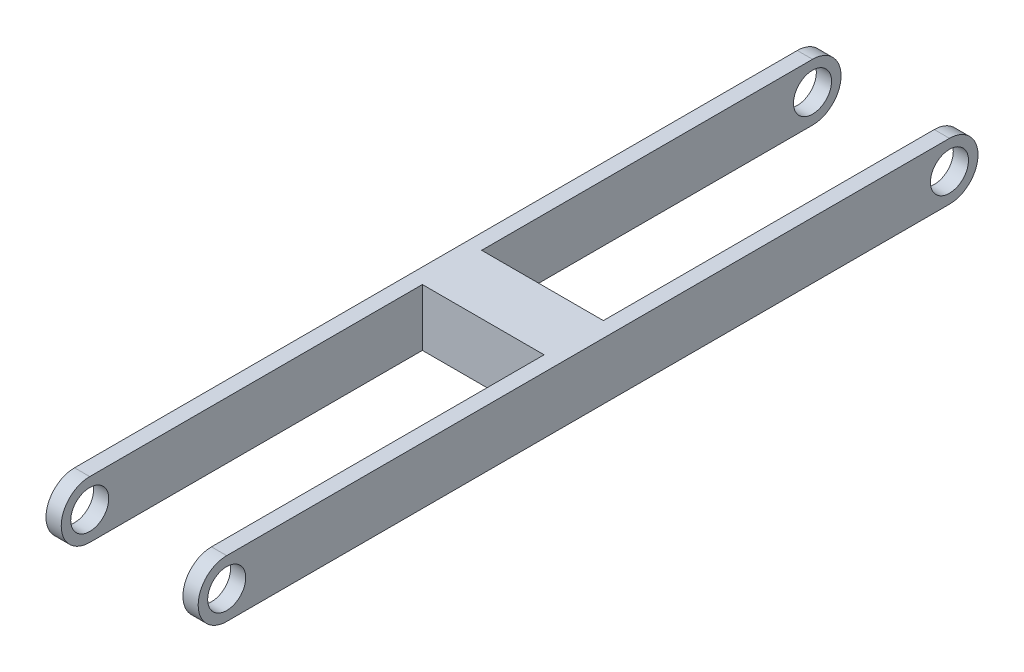
ISO-10303-21;
HEADER;
FILE_DESCRIPTION(('STEP AP214'),'2;1');
FILE_NAME('part.step','',(''),(''),'','','');
FILE_SCHEMA(('AUTOMOTIVE_DESIGN { 1 0 10303 214 1 1 1 1 }'));
ENDSEC;
DATA;
#1=APPLICATION_CONTEXT('core data for automotive mechanical design processes');
#2=APPLICATION_PROTOCOL_DEFINITION('international standard','automotive_design',2000,#1);
#3=PRODUCT_CONTEXT('',#1,'mechanical');
#4=PRODUCT('Part','Part','',(#3));
#5=PRODUCT_RELATED_PRODUCT_CATEGORY('part','',(#4));
#6=PRODUCT_DEFINITION_FORMATION('','',#4);
#7=PRODUCT_DEFINITION_CONTEXT('part definition',#1,'design');
#8=PRODUCT_DEFINITION('design','',#6,#7);
#9=PRODUCT_DEFINITION_SHAPE('','',#8);
#10=(LENGTH_UNIT() NAMED_UNIT(*) SI_UNIT(.MILLI.,.METRE.));
#11=(NAMED_UNIT(*) PLANE_ANGLE_UNIT() SI_UNIT($,.RADIAN.));
#12=(NAMED_UNIT(*) SI_UNIT($,.STERADIAN.) SOLID_ANGLE_UNIT());
#13=UNCERTAINTY_MEASURE_WITH_UNIT(LENGTH_MEASURE(1.E-05),#10,'distance_accuracy_value','');
#14=(GEOMETRIC_REPRESENTATION_CONTEXT(3) GLOBAL_UNCERTAINTY_ASSIGNED_CONTEXT((#13)) GLOBAL_UNIT_ASSIGNED_CONTEXT((#10,
#11,#12)) REPRESENTATION_CONTEXT('',''));
#15=CARTESIAN_POINT('',(0.,0.,0.));
#16=DIRECTION('',(0.,0.,1.));
#17=DIRECTION('',(1.,0.,0.));
#18=AXIS2_PLACEMENT_3D('',#15,#16,#17);
#19=CARTESIAN_POINT('',(20.,0.,47.4999999999999));
#20=DIRECTION('',(-1.,0.,0.));
#21=DIRECTION('',(0.,0.,1.));
#22=AXIS2_PLACEMENT_3D('',#19,#20,#21);
#23=CYLINDRICAL_SURFACE('',#22,3.74999999999997);
#24=CARTESIAN_POINT('',(18.,0.,47.4999999999999));
#25=DIRECTION('',(1.,0.,0.));
#26=DIRECTION('',(0.,0.,-1.));
#27=AXIS2_PLACEMENT_3D('',#24,#25,#26);
#28=CIRCLE('',#27,3.74999999999997);
#29=CARTESIAN_POINT('',(18.,3.74999999999997,47.4999999999999));
#30=VERTEX_POINT('',#29);
#31=CARTESIAN_POINT('',(18.,-3.75000000000003,47.4999999999999));
#32=VERTEX_POINT('',#31);
#33=EDGE_CURVE('E177',#30,#32,#28,.T.);
#34=ORIENTED_EDGE('',*,*,#33,.T.);
#35=DIRECTION('',(-1.,0.,0.));
#36=VECTOR('',#35,1.);
#37=CARTESIAN_POINT('',(20.,-3.74999999999997,47.4999999999999));
#38=LINE('',#37,#36);
#39=CARTESIAN_POINT('',(20.,-3.74999999999997,47.4999999999999));
#40=VERTEX_POINT('',#39);
#41=EDGE_CURVE('E139',#40,#32,#38,.T.);
#42=ORIENTED_EDGE('',*,*,#41,.F.);
#43=CARTESIAN_POINT('',(20.,0.,47.4999999999999));
#44=DIRECTION('',(1.,0.,0.));
#45=DIRECTION('',(0.,0.,1.));
#46=AXIS2_PLACEMENT_3D('',#43,#44,#45);
#47=CIRCLE('',#46,3.74999999999997);
#48=CARTESIAN_POINT('',(20.,3.74999999999997,47.4999999999999));
#49=VERTEX_POINT('',#48);
#50=EDGE_CURVE('E192',#49,#40,#47,.T.);
#51=ORIENTED_EDGE('',*,*,#50,.F.);
#52=DIRECTION('',(-1.,0.,0.));
#53=VECTOR('',#52,1.);
#54=CARTESIAN_POINT('',(20.,3.74999999999997,47.4999999999999));
#55=LINE('',#54,#53);
#56=EDGE_CURVE('E213',#49,#30,#55,.T.);
#57=ORIENTED_EDGE('',*,*,#56,.T.);
#58=EDGE_LOOP('',(#34,#42,#51,#57));
#59=FACE_BOUND('',#58,.T.);
#60=ADVANCED_FACE('F32',(#59),#23,.T.);
#61=CARTESIAN_POINT('',(20.,0.,-47.5000000000001));
#62=DIRECTION('',(-1.,0.,0.));
#63=DIRECTION('',(0.,0.,1.));
#64=AXIS2_PLACEMENT_3D('',#61,#62,#63);
#65=CYLINDRICAL_SURFACE('',#64,3.75);
#66=CARTESIAN_POINT('',(1.99999999999999,0.,-47.5000000000001));
#67=DIRECTION('',(-1.,0.,0.));
#68=DIRECTION('',(0.,0.,1.));
#69=AXIS2_PLACEMENT_3D('',#66,#67,#68);
#70=CIRCLE('',#69,3.75);
#71=CARTESIAN_POINT('',(1.99999999999999,3.75000000000002,-47.5000000000001));
#72=VERTEX_POINT('',#71);
#73=CARTESIAN_POINT('',(1.99999999999999,-3.74999999999998,-47.5000000000001));
#74=VERTEX_POINT('',#73);
#75=EDGE_CURVE('E167',#72,#74,#70,.T.);
#76=ORIENTED_EDGE('',*,*,#75,.T.);
#77=DIRECTION('',(-1.,0.,0.));
#78=VECTOR('',#77,1.);
#79=CARTESIAN_POINT('',(20.,-3.74999999999998,-47.5000000000001));
#80=LINE('',#79,#78);
#81=CARTESIAN_POINT('',(0.,-3.74999999999998,-47.5000000000001));
#82=VERTEX_POINT('',#81);
#83=EDGE_CURVE('E220',#74,#82,#80,.T.);
#84=ORIENTED_EDGE('',*,*,#83,.T.);
#85=CARTESIAN_POINT('',(0.,0.,-47.5000000000001));
#86=DIRECTION('',(1.,0.,0.));
#87=DIRECTION('',(0.,0.,1.));
#88=AXIS2_PLACEMENT_3D('',#85,#86,#87);
#89=CIRCLE('',#88,3.75);
#90=CARTESIAN_POINT('',(0.,3.75000000000002,-47.5000000000001));
#91=VERTEX_POINT('',#90);
#92=EDGE_CURVE('E208',#82,#91,#89,.T.);
#93=ORIENTED_EDGE('',*,*,#92,.T.);
#94=DIRECTION('',(-1.,0.,0.));
#95=VECTOR('',#94,1.);
#96=CARTESIAN_POINT('',(20.,3.75000000000002,-47.5000000000001));
#97=LINE('',#96,#95);
#98=EDGE_CURVE('E216',#72,#91,#97,.T.);
#99=ORIENTED_EDGE('',*,*,#98,.F.);
#100=EDGE_LOOP('',(#76,#84,#93,#99));
#101=FACE_BOUND('',#100,.T.);
#102=ADVANCED_FACE('F248',(#101),#65,.T.);
#103=CARTESIAN_POINT('',(20.,0.,47.4999999999999));
#104=DIRECTION('',(-1.,0.,0.));
#105=DIRECTION('',(0.,0.,1.));
#106=AXIS2_PLACEMENT_3D('',#103,#104,#105);
#107=CYLINDRICAL_SURFACE('',#106,2.5);
#108=CARTESIAN_POINT('',(18.,0.,47.4999999999999));
#109=DIRECTION('',(1.,0.,0.));
#110=DIRECTION('',(0.,0.,-1.));
#111=AXIS2_PLACEMENT_3D('',#108,#109,#110);
#112=CIRCLE('',#111,2.5);
#113=CARTESIAN_POINT('',(18.,0.,44.9999999999999));
#114=VERTEX_POINT('',#113);
#115=EDGE_CURVE('E175',#114,#114,#112,.T.);
#116=ORIENTED_EDGE('',*,*,#115,.F.);
#117=EDGE_LOOP('',(#116));
#118=FACE_BOUND('',#117,.T.);
#119=CARTESIAN_POINT('',(20.,0.,47.4999999999999));
#120=DIRECTION('',(1.,0.,0.));
#121=DIRECTION('',(0.,0.,-1.));
#122=AXIS2_PLACEMENT_3D('',#119,#120,#121);
#123=CIRCLE('',#122,2.5);
#124=CARTESIAN_POINT('',(20.,0.,44.9999999999999));
#125=VERTEX_POINT('',#124);
#126=EDGE_CURVE('E186',#125,#125,#123,.T.);
#127=ORIENTED_EDGE('',*,*,#126,.T.);
#128=EDGE_LOOP('',(#127));
#129=FACE_BOUND('',#128,.T.);
#130=ADVANCED_FACE('F282',(#118,#129),#107,.F.);
#131=CARTESIAN_POINT('',(20.,0.,-47.5000000000001));
#132=DIRECTION('',(-1.,0.,0.));
#133=DIRECTION('',(0.,0.,1.));
#134=AXIS2_PLACEMENT_3D('',#131,#132,#133);
#135=CYLINDRICAL_SURFACE('',#134,2.5);
#136=CARTESIAN_POINT('',(1.99999999999999,0.,-47.5000000000001));
#137=DIRECTION('',(-1.,0.,0.));
#138=DIRECTION('',(0.,0.,1.));
#139=AXIS2_PLACEMENT_3D('',#136,#137,#138);
#140=CIRCLE('',#139,2.5);
#141=CARTESIAN_POINT('',(1.99999999999999,0.,-45.0000000000001));
#142=VERTEX_POINT('',#141);
#143=EDGE_CURVE('E163',#142,#142,#140,.T.);
#144=ORIENTED_EDGE('',*,*,#143,.F.);
#145=EDGE_LOOP('',(#144));
#146=FACE_BOUND('',#145,.T.);
#147=CARTESIAN_POINT('',(0.,0.,-47.5000000000001));
#148=DIRECTION('',(1.,0.,0.));
#149=DIRECTION('',(0.,0.,-1.));
#150=AXIS2_PLACEMENT_3D('',#147,#148,#149);
#151=CIRCLE('',#150,2.5);
#152=CARTESIAN_POINT('',(0.,0.,-50.0000000000001));
#153=VERTEX_POINT('',#152);
#154=EDGE_CURVE('E179',#153,#153,#151,.T.);
#155=ORIENTED_EDGE('',*,*,#154,.F.);
#156=EDGE_LOOP('',(#155));
#157=FACE_BOUND('',#156,.T.);
#158=ADVANCED_FACE('F295',(#146,#157),#135,.F.);
#159=CARTESIAN_POINT('',(20.,0.,47.4999999999999));
#160=DIRECTION('',(-1.,0.,0.));
#161=DIRECTION('',(0.,0.,1.));
#162=AXIS2_PLACEMENT_3D('',#159,#160,#161);
#163=PLANE('',#162);
#164=ORIENTED_EDGE('',*,*,#50,.T.);
#165=DIRECTION('',(0.,0.,-1.));
#166=VECTOR('',#165,1.);
#167=CARTESIAN_POINT('',(20.,-3.74999999999998,-47.5000000000001));
#168=LINE('',#167,#166);
#169=CARTESIAN_POINT('',(20.,-3.74999999999998,-47.5000000000001));
#170=VERTEX_POINT('',#169);
#171=EDGE_CURVE('E195',#40,#170,#168,.T.);
#172=ORIENTED_EDGE('',*,*,#171,.T.);
#173=CARTESIAN_POINT('',(20.,0.,-47.5000000000001));
#174=DIRECTION('',(1.,0.,0.));
#175=DIRECTION('',(0.,0.,1.));
#176=AXIS2_PLACEMENT_3D('',#173,#174,#175);
#177=CIRCLE('',#176,3.75);
#178=CARTESIAN_POINT('',(20.,3.75000000000002,-47.5000000000001));
#179=VERTEX_POINT('',#178);
#180=EDGE_CURVE('E198',#170,#179,#177,.T.);
#181=ORIENTED_EDGE('',*,*,#180,.T.);
#182=DIRECTION('',(0.,0.,1.));
#183=VECTOR('',#182,1.);
#184=CARTESIAN_POINT('',(20.,3.75000000000002,-47.5000000000001));
#185=LINE('',#184,#183);
#186=EDGE_CURVE('E200',#179,#49,#185,.T.);
#187=ORIENTED_EDGE('',*,*,#186,.T.);
#188=EDGE_LOOP('',(#164,#172,#181,#187));
#189=FACE_BOUND('',#188,.T.);
#190=ORIENTED_EDGE('',*,*,#126,.F.);
#191=EDGE_LOOP('',(#190));
#192=FACE_BOUND('',#191,.T.);
#193=CARTESIAN_POINT('',(20.,0.,-47.5000000000001));
#194=DIRECTION('',(1.,0.,0.));
#195=DIRECTION('',(0.,0.,-1.));
#196=AXIS2_PLACEMENT_3D('',#193,#194,#195);
#197=CIRCLE('',#196,2.5);
#198=CARTESIAN_POINT('',(20.,0.,-50.0000000000001));
#199=VERTEX_POINT('',#198);
#200=EDGE_CURVE('E180',#199,#199,#197,.T.);
#201=ORIENTED_EDGE('',*,*,#200,.F.);
#202=EDGE_LOOP('',(#201));
#203=FACE_BOUND('',#202,.T.);
#204=ADVANCED_FACE('F267',(#189,#192,#203),#163,.F.);
#205=CARTESIAN_POINT('',(0.,0.,47.4999999999999));
#206=DIRECTION('',(-1.,0.,0.));
#207=DIRECTION('',(0.,0.,1.));
#208=AXIS2_PLACEMENT_3D('',#205,#206,#207);
#209=PLANE('',#208);
#210=CARTESIAN_POINT('',(0.,0.,47.4999999999999));
#211=DIRECTION('',(1.,0.,0.));
#212=DIRECTION('',(0.,0.,-1.));
#213=AXIS2_PLACEMENT_3D('',#210,#211,#212);
#214=CIRCLE('',#213,2.5);
#215=CARTESIAN_POINT('',(0.,0.,44.9999999999999));
#216=VERTEX_POINT('',#215);
#217=EDGE_CURVE('E183',#216,#216,#214,.T.);
#218=ORIENTED_EDGE('',*,*,#217,.T.);
#219=EDGE_LOOP('',(#218));
#220=FACE_BOUND('',#219,.T.);
#221=CARTESIAN_POINT('',(0.,0.,47.4999999999999));
#222=DIRECTION('',(1.,0.,0.));
#223=DIRECTION('',(0.,0.,1.));
#224=AXIS2_PLACEMENT_3D('',#221,#222,#223);
#225=CIRCLE('',#224,3.74999999999997);
#226=CARTESIAN_POINT('',(0.,3.74999999999997,47.4999999999999));
#227=VERTEX_POINT('',#226);
#228=CARTESIAN_POINT('',(0.,-3.74999999999997,47.4999999999999));
#229=VERTEX_POINT('',#228);
#230=EDGE_CURVE('E189',#227,#229,#225,.T.);
#231=ORIENTED_EDGE('',*,*,#230,.F.);
#232=DIRECTION('',(0.,0.,1.));
#233=VECTOR('',#232,1.);
#234=CARTESIAN_POINT('',(0.,3.75000000000002,-47.5000000000001));
#235=LINE('',#234,#233);
#236=EDGE_CURVE('E196',#91,#227,#235,.T.);
#237=ORIENTED_EDGE('',*,*,#236,.F.);
#238=ORIENTED_EDGE('',*,*,#92,.F.);
#239=DIRECTION('',(0.,0.,-1.));
#240=VECTOR('',#239,1.);
#241=CARTESIAN_POINT('',(0.,-3.74999999999998,-47.5000000000001));
#242=LINE('',#241,#240);
#243=EDGE_CURVE('E205',#229,#82,#242,.T.);
#244=ORIENTED_EDGE('',*,*,#243,.F.);
#245=EDGE_LOOP('',(#231,#237,#238,#244));
#246=FACE_BOUND('',#245,.T.);
#247=ORIENTED_EDGE('',*,*,#154,.T.);
#248=EDGE_LOOP('',(#247));
#249=FACE_BOUND('',#248,.T.);
#250=ADVANCED_FACE('F255',(#220,#246,#249),#209,.T.);
#251=CARTESIAN_POINT('',(2.,0.,47.4999999999999));
#252=DIRECTION('',(-1.,0.,0.));
#253=DIRECTION('',(0.,0.,1.));
#254=AXIS2_PLACEMENT_3D('',#251,#252,#253);
#255=CIRCLE('',#254,3.74999999999997);
#256=CARTESIAN_POINT('',(2.,-3.75000000000003,47.4999999999999));
#257=VERTEX_POINT('',#256);
#258=CARTESIAN_POINT('',(2.,3.74999999999997,47.4999999999999));
#259=VERTEX_POINT('',#258);
#260=EDGE_CURVE('E173',#257,#259,#255,.T.);
#261=ORIENTED_EDGE('',*,*,#260,.T.);
#262=EDGE_CURVE('E202',#259,#227,#55,.T.);
#263=ORIENTED_EDGE('',*,*,#262,.T.);
#264=ORIENTED_EDGE('',*,*,#230,.T.);
#265=EDGE_CURVE('E224',#257,#229,#38,.T.);
#266=ORIENTED_EDGE('',*,*,#265,.F.);
#267=EDGE_LOOP('',(#261,#263,#264,#266));
#268=FACE_BOUND('',#267,.T.);
#269=ADVANCED_FACE('F34',(#268),#23,.T.);
#270=CARTESIAN_POINT('',(20.,-3.74999999999998,-47.5000000000001));
#271=DIRECTION('',(0.,1.,0.));
#272=DIRECTION('',(0.,0.,1.));
#273=AXIS2_PLACEMENT_3D('',#270,#271,#272);
#274=PLANE('',#273);
#275=ORIENTED_EDGE('',*,*,#41,.T.);
#276=DIRECTION('',(0.,0.,-1.));
#277=VECTOR('',#276,1.);
#278=CARTESIAN_POINT('',(18.,-3.75000000000001,3.77916470370454));
#279=LINE('',#278,#277);
#280=CARTESIAN_POINT('',(18.,-3.75000000000001,3.77916470370454));
#281=VERTEX_POINT('',#280);
#282=EDGE_CURVE('E122',#32,#281,#279,.T.);
#283=ORIENTED_EDGE('',*,*,#282,.T.);
#284=DIRECTION('',(-1.,0.,0.));
#285=VECTOR('',#284,1.);
#286=CARTESIAN_POINT('',(1.99999999999999,-3.75000000000001,3.77916470370454));
#287=LINE('',#286,#285);
#288=CARTESIAN_POINT('',(1.99999999999999,-3.75000000000001,3.77916470370454));
#289=VERTEX_POINT('',#288);
#290=EDGE_CURVE('E130',#281,#289,#287,.T.);
#291=ORIENTED_EDGE('',*,*,#290,.T.);
#292=DIRECTION('',(0.,0.,1.));
#293=VECTOR('',#292,1.);
#294=CARTESIAN_POINT('',(1.99999999999999,-3.75000000000001,3.77916470370454));
#295=LINE('',#294,#293);
#296=EDGE_CURVE('E127',#289,#257,#295,.T.);
#297=ORIENTED_EDGE('',*,*,#296,.T.);
#298=ORIENTED_EDGE('',*,*,#265,.T.);
#299=ORIENTED_EDGE('',*,*,#243,.T.);
#300=ORIENTED_EDGE('',*,*,#83,.F.);
#301=DIRECTION('',(0.,0.,1.));
#302=VECTOR('',#301,1.);
#303=CARTESIAN_POINT('',(1.99999999999999,-3.74999999999998,-51.2500000000002));
#304=LINE('',#303,#302);
#305=CARTESIAN_POINT('',(1.99999999999999,-3.75,-4.01018627667091));
#306=VERTEX_POINT('',#305);
#307=EDGE_CURVE('E148',#74,#306,#304,.T.);
#308=ORIENTED_EDGE('',*,*,#307,.T.);
#309=DIRECTION('',(1.,0.,0.));
#310=VECTOR('',#309,1.);
#311=CARTESIAN_POINT('',(1.99999999999999,-3.75,-4.01018627667091));
#312=LINE('',#311,#310);
#313=CARTESIAN_POINT('',(18.,-3.75,-4.01018627667091));
#314=VERTEX_POINT('',#313);
#315=EDGE_CURVE('E151',#306,#314,#312,.T.);
#316=ORIENTED_EDGE('',*,*,#315,.T.);
#317=DIRECTION('',(0.,0.,-1.));
#318=VECTOR('',#317,1.);
#319=CARTESIAN_POINT('',(18.,-3.74999999999998,-51.2500000000002));
#320=LINE('',#319,#318);
#321=CARTESIAN_POINT('',(18.,-3.74999999999998,-47.5000000000001));
#322=VERTEX_POINT('',#321);
#323=EDGE_CURVE('E154',#314,#322,#320,.T.);
#324=ORIENTED_EDGE('',*,*,#323,.T.);
#325=EDGE_CURVE('E221',#170,#322,#80,.T.);
#326=ORIENTED_EDGE('',*,*,#325,.F.);
#327=ORIENTED_EDGE('',*,*,#171,.F.);
#328=EDGE_LOOP('',(#275,#283,#291,#297,#298,#299,#300,#308,#316,#324,#326,#327));
#329=FACE_BOUND('',#328,.T.);
#330=ADVANCED_FACE('F137',(#329),#274,.F.);
#331=CARTESIAN_POINT('',(18.,0.,-47.5000000000001));
#332=DIRECTION('',(1.,0.,0.));
#333=DIRECTION('',(0.,0.,-1.));
#334=AXIS2_PLACEMENT_3D('',#331,#332,#333);
#335=CIRCLE('',#334,3.75);
#336=CARTESIAN_POINT('',(18.,3.75000000000002,-47.5000000000001));
#337=VERTEX_POINT('',#336);
#338=EDGE_CURVE('E161',#322,#337,#335,.T.);
#339=ORIENTED_EDGE('',*,*,#338,.T.);
#340=EDGE_CURVE('E217',#179,#337,#97,.T.);
#341=ORIENTED_EDGE('',*,*,#340,.F.);
#342=ORIENTED_EDGE('',*,*,#180,.F.);
#343=ORIENTED_EDGE('',*,*,#325,.T.);
#344=EDGE_LOOP('',(#339,#341,#342,#343));
#345=FACE_BOUND('',#344,.T.);
#346=ADVANCED_FACE('F272',(#345),#65,.T.);
#347=CARTESIAN_POINT('',(20.,3.75000000000002,-47.5000000000001));
#348=DIRECTION('',(0.,-1.,0.));
#349=DIRECTION('',(0.,0.,-1.));
#350=AXIS2_PLACEMENT_3D('',#347,#348,#349);
#351=PLANE('',#350);
#352=DIRECTION('',(1.,0.,0.));
#353=VECTOR('',#352,1.);
#354=CARTESIAN_POINT('',(20.,3.74999999999999,3.77916470370455));
#355=LINE('',#354,#353);
#356=CARTESIAN_POINT('',(1.99999999999999,3.74999999999999,3.77916470370455));
#357=VERTEX_POINT('',#356);
#358=CARTESIAN_POINT('',(18.,3.74999999999999,3.77916470370455));
#359=VERTEX_POINT('',#358);
#360=EDGE_CURVE('E11',#357,#359,#355,.T.);
#361=ORIENTED_EDGE('',*,*,#360,.T.);
#362=DIRECTION('',(0.,0.,1.));
#363=VECTOR('',#362,1.);
#364=CARTESIAN_POINT('',(18.,3.75000000000002,-47.5000000000001));
#365=LINE('',#364,#363);
#366=EDGE_CURVE('E125',#359,#30,#365,.T.);
#367=ORIENTED_EDGE('',*,*,#366,.T.);
#368=ORIENTED_EDGE('',*,*,#56,.F.);
#369=ORIENTED_EDGE('',*,*,#186,.F.);
#370=ORIENTED_EDGE('',*,*,#340,.T.);
#371=DIRECTION('',(0.,0.,1.));
#372=VECTOR('',#371,1.);
#373=CARTESIAN_POINT('',(18.,3.75000000000002,-47.5000000000001));
#374=LINE('',#373,#372);
#375=CARTESIAN_POINT('',(18.,3.75,-4.0101862766709));
#376=VERTEX_POINT('',#375);
#377=EDGE_CURVE('E158',#337,#376,#374,.T.);
#378=ORIENTED_EDGE('',*,*,#377,.T.);
#379=DIRECTION('',(-1.,0.,0.));
#380=VECTOR('',#379,1.);
#381=CARTESIAN_POINT('',(20.,3.75,-4.0101862766709));
#382=LINE('',#381,#380);
#383=CARTESIAN_POINT('',(1.99999999999999,3.75,-4.0101862766709));
#384=VERTEX_POINT('',#383);
#385=EDGE_CURVE('E40',#376,#384,#382,.T.);
#386=ORIENTED_EDGE('',*,*,#385,.T.);
#387=DIRECTION('',(0.,0.,-1.));
#388=VECTOR('',#387,1.);
#389=CARTESIAN_POINT('',(1.99999999999999,3.75000000000002,-47.5000000000001));
#390=LINE('',#389,#388);
#391=EDGE_CURVE('E164',#384,#72,#390,.T.);
#392=ORIENTED_EDGE('',*,*,#391,.T.);
#393=ORIENTED_EDGE('',*,*,#98,.T.);
#394=ORIENTED_EDGE('',*,*,#236,.T.);
#395=ORIENTED_EDGE('',*,*,#262,.F.);
#396=DIRECTION('',(0.,0.,-1.));
#397=VECTOR('',#396,1.);
#398=CARTESIAN_POINT('',(1.99999999999999,3.75000000000002,-47.5000000000001));
#399=LINE('',#398,#397);
#400=EDGE_CURVE('E170',#259,#357,#399,.T.);
#401=ORIENTED_EDGE('',*,*,#400,.T.);
#402=EDGE_LOOP('',(#361,#367,#368,#369,#370,#378,#386,#392,#393,#394,#395,#401));
#403=FACE_BOUND('',#402,.T.);
#404=ADVANCED_FACE('F235',(#403),#351,.F.);
#405=CARTESIAN_POINT('',(2.,0.,47.4999999999999));
#406=DIRECTION('',(-1.,0.,0.));
#407=DIRECTION('',(0.,0.,1.));
#408=AXIS2_PLACEMENT_3D('',#405,#406,#407);
#409=CIRCLE('',#408,2.5);
#410=CARTESIAN_POINT('',(2.,0.,49.9999999999999));
#411=VERTEX_POINT('',#410);
#412=EDGE_CURVE('E169',#411,#411,#409,.T.);
#413=ORIENTED_EDGE('',*,*,#412,.F.);
#414=EDGE_LOOP('',(#413));
#415=FACE_BOUND('',#414,.T.);
#416=ORIENTED_EDGE('',*,*,#217,.F.);
#417=EDGE_LOOP('',(#416));
#418=FACE_BOUND('',#417,.T.);
#419=ADVANCED_FACE('F279',(#415,#418),#107,.F.);
#420=CARTESIAN_POINT('',(18.,0.,-47.5000000000001));
#421=DIRECTION('',(1.,0.,0.));
#422=DIRECTION('',(0.,0.,-1.));
#423=AXIS2_PLACEMENT_3D('',#420,#421,#422);
#424=CIRCLE('',#423,2.5);
#425=CARTESIAN_POINT('',(18.,0.,-50.0000000000001));
#426=VERTEX_POINT('',#425);
#427=EDGE_CURVE('E146',#426,#426,#424,.T.);
#428=ORIENTED_EDGE('',*,*,#427,.F.);
#429=EDGE_LOOP('',(#428));
#430=FACE_BOUND('',#429,.T.);
#431=ORIENTED_EDGE('',*,*,#200,.T.);
#432=EDGE_LOOP('',(#431));
#433=FACE_BOUND('',#432,.T.);
#434=ADVANCED_FACE('F300',(#430,#433),#135,.F.);
#435=CARTESIAN_POINT('',(1.99999999999999,-3.75,-4.01018627667091));
#436=DIRECTION('',(0.,0.,1.));
#437=DIRECTION('',(0.,-1.,0.));
#438=AXIS2_PLACEMENT_3D('',#435,#436,#437);
#439=PLANE('',#438);
#440=DIRECTION('',(0.,1.,0.));
#441=VECTOR('',#440,1.);
#442=CARTESIAN_POINT('',(18.,-3.75,-4.01018627667091));
#443=LINE('',#442,#441);
#444=EDGE_CURVE('E140',#314,#376,#443,.T.);
#445=ORIENTED_EDGE('',*,*,#444,.F.);
#446=ORIENTED_EDGE('',*,*,#315,.F.);
#447=DIRECTION('',(0.,1.,0.));
#448=VECTOR('',#447,1.);
#449=CARTESIAN_POINT('',(1.99999999999999,-3.75,-4.01018627667091));
#450=LINE('',#449,#448);
#451=EDGE_CURVE('E55',#306,#384,#450,.T.);
#452=ORIENTED_EDGE('',*,*,#451,.T.);
#453=ORIENTED_EDGE('',*,*,#385,.F.);
#454=EDGE_LOOP('',(#445,#446,#452,#453));
#455=FACE_BOUND('',#454,.T.);
#456=ADVANCED_FACE('F238',(#455),#439,.F.);
#457=CARTESIAN_POINT('',(1.99999999999999,-3.74999999999998,-51.2500000000002));
#458=DIRECTION('',(-1.,0.,0.));
#459=DIRECTION('',(0.,0.,1.));
#460=AXIS2_PLACEMENT_3D('',#457,#458,#459);
#461=PLANE('',#460);
#462=ORIENTED_EDGE('',*,*,#143,.T.);
#463=EDGE_LOOP('',(#462));
#464=FACE_BOUND('',#463,.T.);
#465=ORIENTED_EDGE('',*,*,#75,.F.);
#466=ORIENTED_EDGE('',*,*,#391,.F.);
#467=ORIENTED_EDGE('',*,*,#451,.F.);
#468=ORIENTED_EDGE('',*,*,#307,.F.);
#469=EDGE_LOOP('',(#465,#466,#467,#468));
#470=FACE_BOUND('',#469,.T.);
#471=ADVANCED_FACE('F246',(#464,#470),#461,.F.);
#472=CARTESIAN_POINT('',(18.,-3.74999999999998,-51.2500000000002));
#473=DIRECTION('',(1.,0.,0.));
#474=DIRECTION('',(0.,0.,-1.));
#475=AXIS2_PLACEMENT_3D('',#472,#473,#474);
#476=PLANE('',#475);
#477=ORIENTED_EDGE('',*,*,#427,.T.);
#478=EDGE_LOOP('',(#477));
#479=FACE_BOUND('',#478,.T.);
#480=ORIENTED_EDGE('',*,*,#323,.F.);
#481=ORIENTED_EDGE('',*,*,#444,.T.);
#482=ORIENTED_EDGE('',*,*,#377,.F.);
#483=ORIENTED_EDGE('',*,*,#338,.F.);
#484=EDGE_LOOP('',(#480,#481,#482,#483));
#485=FACE_BOUND('',#484,.T.);
#486=ADVANCED_FACE('F241',(#479,#485),#476,.F.);
#487=CARTESIAN_POINT('',(1.99999999999999,-3.75000000000001,3.77916470370454));
#488=DIRECTION('',(0.,0.,-1.));
#489=DIRECTION('',(0.,1.,0.));
#490=AXIS2_PLACEMENT_3D('',#487,#488,#489);
#491=PLANE('',#490);
#492=DIRECTION('',(0.,1.,0.));
#493=VECTOR('',#492,1.);
#494=CARTESIAN_POINT('',(1.99999999999999,-3.75000000000001,3.77916470370454));
#495=LINE('',#494,#493);
#496=EDGE_CURVE('E126',#289,#357,#495,.T.);
#497=ORIENTED_EDGE('',*,*,#496,.F.);
#498=ORIENTED_EDGE('',*,*,#290,.F.);
#499=DIRECTION('',(0.,1.,0.));
#500=VECTOR('',#499,1.);
#501=CARTESIAN_POINT('',(18.,-3.75000000000001,3.77916470370454));
#502=LINE('',#501,#500);
#503=EDGE_CURVE('E47',#281,#359,#502,.T.);
#504=ORIENTED_EDGE('',*,*,#503,.T.);
#505=ORIENTED_EDGE('',*,*,#360,.F.);
#506=EDGE_LOOP('',(#497,#498,#504,#505));
#507=FACE_BOUND('',#506,.T.);
#508=ADVANCED_FACE('F131',(#507),#491,.F.);
#509=CARTESIAN_POINT('',(18.,-3.75000000000001,3.77916470370454));
#510=DIRECTION('',(1.,0.,0.));
#511=DIRECTION('',(0.,0.,-1.));
#512=AXIS2_PLACEMENT_3D('',#509,#510,#511);
#513=PLANE('',#512);
#514=ORIENTED_EDGE('',*,*,#115,.T.);
#515=EDGE_LOOP('',(#514));
#516=FACE_BOUND('',#515,.T.);
#517=ORIENTED_EDGE('',*,*,#33,.F.);
#518=ORIENTED_EDGE('',*,*,#366,.F.);
#519=ORIENTED_EDGE('',*,*,#503,.F.);
#520=ORIENTED_EDGE('',*,*,#282,.F.);
#521=EDGE_LOOP('',(#517,#518,#519,#520));
#522=FACE_BOUND('',#521,.T.);
#523=ADVANCED_FACE('F120',(#516,#522),#513,.F.);
#524=CARTESIAN_POINT('',(1.99999999999999,-3.75000000000001,3.77916470370454));
#525=DIRECTION('',(-1.,0.,0.));
#526=DIRECTION('',(0.,0.,1.));
#527=AXIS2_PLACEMENT_3D('',#524,#525,#526);
#528=PLANE('',#527);
#529=ORIENTED_EDGE('',*,*,#412,.T.);
#530=EDGE_LOOP('',(#529));
#531=FACE_BOUND('',#530,.T.);
#532=ORIENTED_EDGE('',*,*,#296,.F.);
#533=ORIENTED_EDGE('',*,*,#496,.T.);
#534=ORIENTED_EDGE('',*,*,#400,.F.);
#535=ORIENTED_EDGE('',*,*,#260,.F.);
#536=EDGE_LOOP('',(#532,#533,#534,#535));
#537=FACE_BOUND('',#536,.T.);
#538=ADVANCED_FACE('F261',(#531,#537),#528,.F.);
#539=CLOSED_SHELL('',(#60,#102,#130,#158,#204,#250,#269,#330,#346,#404,#419,#434,#456,#471,#486,
#508,#523,#538));
#540=MANIFOLD_SOLID_BREP('B2',#539);
#541=ADVANCED_BREP_SHAPE_REPRESENTATION('',(#18,#540),#14);
#542=SHAPE_DEFINITION_REPRESENTATION(#9,#541);
ENDSEC;
END-ISO-10303-21;
